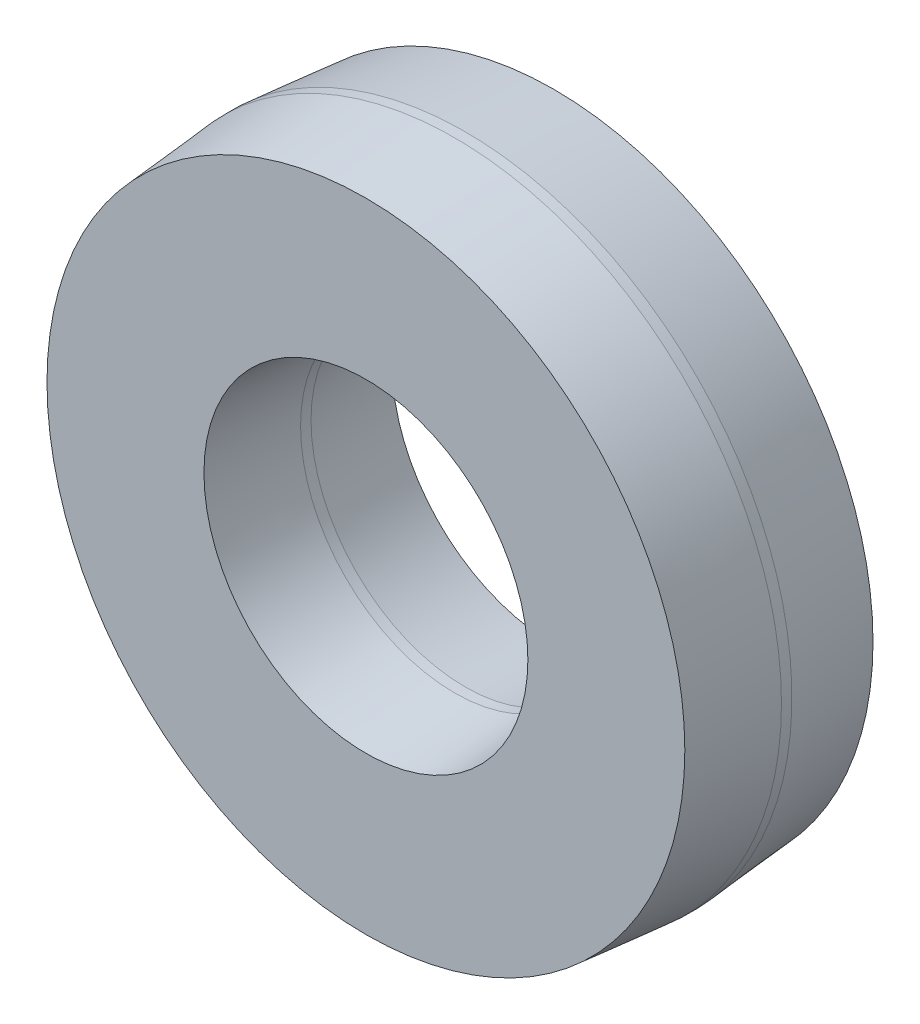
ISO-10303-21;
HEADER;
FILE_DESCRIPTION(('STEP AP214'),'2;1');
FILE_NAME('part.step','',(''),(''),'','','');
FILE_SCHEMA(('AUTOMOTIVE_DESIGN { 1 0 10303 214 1 1 1 1 }'));
ENDSEC;
DATA;
#1=APPLICATION_CONTEXT('core data for automotive mechanical design processes');
#2=APPLICATION_PROTOCOL_DEFINITION('international standard','automotive_design',2000,#1);
#3=PRODUCT_CONTEXT('',#1,'mechanical');
#4=PRODUCT('Part','Part','',(#3));
#5=PRODUCT_RELATED_PRODUCT_CATEGORY('part','',(#4));
#6=PRODUCT_DEFINITION_FORMATION('','',#4);
#7=PRODUCT_DEFINITION_CONTEXT('part definition',#1,'design');
#8=PRODUCT_DEFINITION('design','',#6,#7);
#9=PRODUCT_DEFINITION_SHAPE('','',#8);
#10=(LENGTH_UNIT() NAMED_UNIT(*) SI_UNIT(.MILLI.,.METRE.));
#11=(NAMED_UNIT(*) PLANE_ANGLE_UNIT() SI_UNIT($,.RADIAN.));
#12=(NAMED_UNIT(*) SI_UNIT($,.STERADIAN.) SOLID_ANGLE_UNIT());
#13=UNCERTAINTY_MEASURE_WITH_UNIT(LENGTH_MEASURE(1.E-05),#10,'distance_accuracy_value','');
#14=(GEOMETRIC_REPRESENTATION_CONTEXT(3) GLOBAL_UNCERTAINTY_ASSIGNED_CONTEXT((#13)) GLOBAL_UNIT_ASSIGNED_CONTEXT((#10,
#11,#12)) REPRESENTATION_CONTEXT('',''));
#15=CARTESIAN_POINT('',(0.,0.,0.));
#16=DIRECTION('',(0.,0.,1.));
#17=DIRECTION('',(1.,0.,0.));
#18=AXIS2_PLACEMENT_3D('',#15,#16,#17);
#19=CARTESIAN_POINT('',(0.,0.,17.));
#20=DIRECTION('',(0.,0.,1.));
#21=DIRECTION('',(1.,0.,0.));
#22=AXIS2_PLACEMENT_3D('',#19,#20,#21);
#23=PLANE('',#22);
#24=CARTESIAN_POINT('',(0.,0.,17.));
#25=DIRECTION('',(0.,0.,1.));
#26=DIRECTION('',(1.,0.,0.));
#27=AXIS2_PLACEMENT_3D('',#24,#25,#26);
#28=CIRCLE('',#27,61.0126927200593);
#29=CARTESIAN_POINT('',(61.0126927200593,0.,17.));
#30=VERTEX_POINT('',#29);
#31=EDGE_CURVE('E10',#30,#30,#28,.T.);
#32=ORIENTED_EDGE('',*,*,#31,.T.);
#33=EDGE_LOOP('',(#32));
#34=FACE_BOUND('',#33,.T.);
#35=CARTESIAN_POINT('',(0.,0.,17.));
#36=DIRECTION('',(0.,0.,1.));
#37=DIRECTION('',(1.,0.,0.));
#38=AXIS2_PLACEMENT_3D('',#35,#36,#37);
#39=CIRCLE('',#38,30.9873072799407);
#40=CARTESIAN_POINT('',(30.9873072799407,0.,17.));
#41=VERTEX_POINT('',#40);
#42=EDGE_CURVE('E33',#41,#41,#39,.T.);
#43=ORIENTED_EDGE('',*,*,#42,.F.);
#44=EDGE_LOOP('',(#43));
#45=FACE_BOUND('',#44,.T.);
#46=ADVANCED_FACE('F29',(#34,#45),#23,.T.);
#47=CARTESIAN_POINT('',(0.,0.,0.));
#48=DIRECTION('',(0.,0.,-1.));
#49=DIRECTION('',(1.,0.,0.));
#50=AXIS2_PLACEMENT_3D('',#47,#48,#49);
#51=CONICAL_SURFACE('',#50,62.5,0.0872664625997165);
#52=ORIENTED_EDGE('',*,*,#31,.F.);
#53=EDGE_LOOP('',(#52));
#54=FACE_BOUND('',#53,.T.);
#55=CARTESIAN_POINT('',(0.,0.,0.));
#56=DIRECTION('',(0.,0.,-1.));
#57=DIRECTION('',(-1.,0.,0.));
#58=AXIS2_PLACEMENT_3D('',#55,#56,#57);
#59=CIRCLE('',#58,62.5);
#60=CARTESIAN_POINT('',(-62.5,0.,0.));
#61=VERTEX_POINT('',#60);
#62=EDGE_CURVE('E45',#61,#61,#59,.T.);
#63=ORIENTED_EDGE('',*,*,#62,.F.);
#64=EDGE_LOOP('',(#63));
#65=FACE_BOUND('',#64,.T.);
#66=ADVANCED_FACE('F76',(#54,#65),#51,.T.);
#67=CARTESIAN_POINT('',(0.,0.,0.));
#68=DIRECTION('',(0.,0.,1.));
#69=DIRECTION('',(1.,0.,0.));
#70=AXIS2_PLACEMENT_3D('',#67,#68,#69);
#71=CONICAL_SURFACE('',#70,29.5,0.0872664625997165);
#72=ORIENTED_EDGE('',*,*,#42,.T.);
#73=EDGE_LOOP('',(#72));
#74=FACE_BOUND('',#73,.T.);
#75=CARTESIAN_POINT('',(0.,0.,0.));
#76=DIRECTION('',(0.,0.,1.));
#77=DIRECTION('',(1.,0.,0.));
#78=AXIS2_PLACEMENT_3D('',#75,#76,#77);
#79=CIRCLE('',#78,29.5);
#80=CARTESIAN_POINT('',(29.5,0.,0.));
#81=VERTEX_POINT('',#80);
#82=EDGE_CURVE('E40',#81,#81,#79,.T.);
#83=ORIENTED_EDGE('',*,*,#82,.F.);
#84=EDGE_LOOP('',(#83));
#85=FACE_BOUND('',#84,.T.);
#86=ADVANCED_FACE('F31',(#74,#85),#71,.F.);
#87=CARTESIAN_POINT('',(0.,0.,-2.));
#88=DIRECTION('',(0.,0.,1.));
#89=DIRECTION('',(1.,0.,0.));
#90=AXIS2_PLACEMENT_3D('',#87,#88,#89);
#91=CYLINDRICAL_SURFACE('',#90,62.5);
#92=CARTESIAN_POINT('',(0.,0.,-2.));
#93=DIRECTION('',(0.,0.,-1.));
#94=DIRECTION('',(-1.,0.,0.));
#95=AXIS2_PLACEMENT_3D('',#92,#93,#94);
#96=CIRCLE('',#95,62.5);
#97=CARTESIAN_POINT('',(-62.5,0.,-2.));
#98=VERTEX_POINT('',#97);
#99=EDGE_CURVE('E44',#98,#98,#96,.T.);
#100=ORIENTED_EDGE('',*,*,#99,.F.);
#101=EDGE_LOOP('',(#100));
#102=FACE_BOUND('',#101,.T.);
#103=ORIENTED_EDGE('',*,*,#62,.T.);
#104=EDGE_LOOP('',(#103));
#105=FACE_BOUND('',#104,.T.);
#106=ADVANCED_FACE('F84',(#102,#105),#91,.T.);
#107=CARTESIAN_POINT('',(0.,0.,-2.));
#108=DIRECTION('',(0.,0.,1.));
#109=DIRECTION('',(1.,0.,0.));
#110=AXIS2_PLACEMENT_3D('',#107,#108,#109);
#111=CYLINDRICAL_SURFACE('',#110,29.5);
#112=CARTESIAN_POINT('',(0.,0.,-2.));
#113=DIRECTION('',(0.,0.,-1.));
#114=DIRECTION('',(-1.,0.,0.));
#115=AXIS2_PLACEMENT_3D('',#112,#113,#114);
#116=CIRCLE('',#115,29.5);
#117=CARTESIAN_POINT('',(-29.5,0.,-2.));
#118=VERTEX_POINT('',#117);
#119=EDGE_CURVE('E54',#118,#118,#116,.T.);
#120=ORIENTED_EDGE('',*,*,#119,.T.);
#121=EDGE_LOOP('',(#120));
#122=FACE_BOUND('',#121,.T.);
#123=ORIENTED_EDGE('',*,*,#82,.T.);
#124=EDGE_LOOP('',(#123));
#125=FACE_BOUND('',#124,.T.);
#126=ADVANCED_FACE('F60',(#122,#125),#111,.F.);
#127=CARTESIAN_POINT('',(0.,0.,-19.));
#128=DIRECTION('',(0.,0.,-1.));
#129=DIRECTION('',(-1.,0.,0.));
#130=AXIS2_PLACEMENT_3D('',#127,#128,#129);
#131=PLANE('',#130);
#132=CARTESIAN_POINT('',(0.,0.,-19.));
#133=DIRECTION('',(0.,0.,-1.));
#134=DIRECTION('',(-1.,0.,0.));
#135=AXIS2_PLACEMENT_3D('',#132,#133,#134);
#136=CIRCLE('',#135,61.0126927200593);
#137=CARTESIAN_POINT('',(-61.0126927200593,0.,-19.));
#138=VERTEX_POINT('',#137);
#139=EDGE_CURVE('E48',#138,#138,#136,.T.);
#140=ORIENTED_EDGE('',*,*,#139,.T.);
#141=EDGE_LOOP('',(#140));
#142=FACE_BOUND('',#141,.T.);
#143=CARTESIAN_POINT('',(0.,0.,-19.));
#144=DIRECTION('',(0.,0.,-1.));
#145=DIRECTION('',(-1.,0.,0.));
#146=AXIS2_PLACEMENT_3D('',#143,#144,#145);
#147=CIRCLE('',#146,30.9873072799407);
#148=CARTESIAN_POINT('',(-30.9873072799407,0.,-19.));
#149=VERTEX_POINT('',#148);
#150=EDGE_CURVE('E51',#149,#149,#147,.T.);
#151=ORIENTED_EDGE('',*,*,#150,.F.);
#152=EDGE_LOOP('',(#151));
#153=FACE_BOUND('',#152,.T.);
#154=ADVANCED_FACE('F71',(#142,#153),#131,.T.);
#155=CARTESIAN_POINT('',(0.,0.,-2.));
#156=DIRECTION('',(0.,0.,1.));
#157=DIRECTION('',(-1.,0.,0.));
#158=AXIS2_PLACEMENT_3D('',#155,#156,#157);
#159=CONICAL_SURFACE('',#158,62.5,0.0872664625997165);
#160=ORIENTED_EDGE('',*,*,#139,.F.);
#161=EDGE_LOOP('',(#160));
#162=FACE_BOUND('',#161,.T.);
#163=ORIENTED_EDGE('',*,*,#99,.T.);
#164=EDGE_LOOP('',(#163));
#165=FACE_BOUND('',#164,.T.);
#166=ADVANCED_FACE('F65',(#162,#165),#159,.T.);
#167=CARTESIAN_POINT('',(0.,0.,-2.));
#168=DIRECTION('',(0.,0.,-1.));
#169=DIRECTION('',(-1.,0.,0.));
#170=AXIS2_PLACEMENT_3D('',#167,#168,#169);
#171=CONICAL_SURFACE('',#170,29.5,0.0872664625997165);
#172=ORIENTED_EDGE('',*,*,#150,.T.);
#173=EDGE_LOOP('',(#172));
#174=FACE_BOUND('',#173,.T.);
#175=ORIENTED_EDGE('',*,*,#119,.F.);
#176=EDGE_LOOP('',(#175));
#177=FACE_BOUND('',#176,.T.);
#178=ADVANCED_FACE('F63',(#174,#177),#171,.F.);
#179=CLOSED_SHELL('',(#46,#66,#86,#106,#126,#154,#166,#178));
#180=MANIFOLD_SOLID_BREP('B2',#179);
#181=ADVANCED_BREP_SHAPE_REPRESENTATION('',(#18,#180),#14);
#182=SHAPE_DEFINITION_REPRESENTATION(#9,#181);
ENDSEC;
END-ISO-10303-21;
